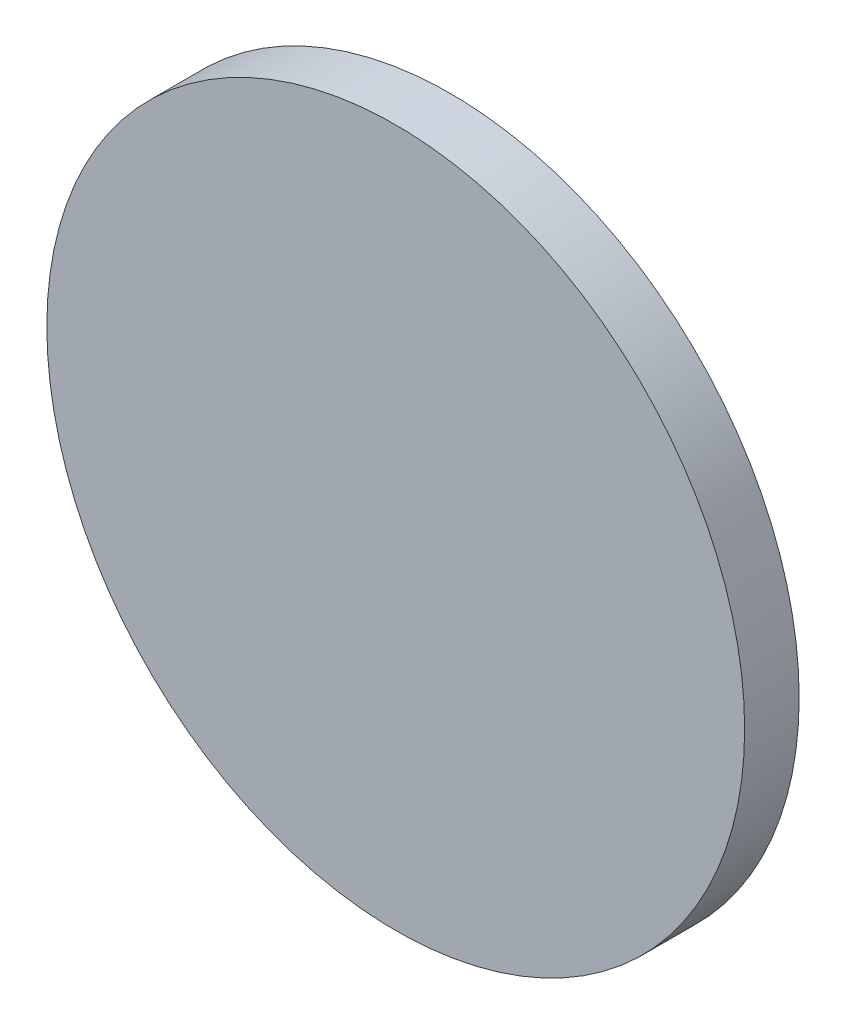
ISO-10303-21;
HEADER;
FILE_DESCRIPTION(('STEP AP214'),'2;1');
FILE_NAME('part.step','',(''),(''),'','','');
FILE_SCHEMA(('AUTOMOTIVE_DESIGN { 1 0 10303 214 1 1 1 1 }'));
ENDSEC;
DATA;
#1=APPLICATION_CONTEXT('core data for automotive mechanical design processes');
#2=APPLICATION_PROTOCOL_DEFINITION('international standard','automotive_design',2000,#1);
#3=PRODUCT_CONTEXT('',#1,'mechanical');
#4=PRODUCT('Part','Part','',(#3));
#5=PRODUCT_RELATED_PRODUCT_CATEGORY('part','',(#4));
#6=PRODUCT_DEFINITION_FORMATION('','',#4);
#7=PRODUCT_DEFINITION_CONTEXT('part definition',#1,'design');
#8=PRODUCT_DEFINITION('design','',#6,#7);
#9=PRODUCT_DEFINITION_SHAPE('','',#8);
#10=(LENGTH_UNIT() NAMED_UNIT(*) SI_UNIT(.MILLI.,.METRE.));
#11=(NAMED_UNIT(*) PLANE_ANGLE_UNIT() SI_UNIT($,.RADIAN.));
#12=(NAMED_UNIT(*) SI_UNIT($,.STERADIAN.) SOLID_ANGLE_UNIT());
#13=UNCERTAINTY_MEASURE_WITH_UNIT(LENGTH_MEASURE(1.E-05),#10,'distance_accuracy_value','');
#14=(GEOMETRIC_REPRESENTATION_CONTEXT(3) GLOBAL_UNCERTAINTY_ASSIGNED_CONTEXT((#13)) GLOBAL_UNIT_ASSIGNED_CONTEXT((#10,
#11,#12)) REPRESENTATION_CONTEXT('',''));
#15=CARTESIAN_POINT('',(0.,0.,0.));
#16=DIRECTION('',(0.,0.,1.));
#17=DIRECTION('',(1.,0.,0.));
#18=AXIS2_PLACEMENT_3D('',#15,#16,#17);
#19=CARTESIAN_POINT('',(0.,0.,10.));
#20=DIRECTION('',(0.,0.,-1.));
#21=DIRECTION('',(-1.,0.,0.));
#22=AXIS2_PLACEMENT_3D('',#19,#20,#21);
#23=CYLINDRICAL_SURFACE('',#22,64.);
#24=CARTESIAN_POINT('',(0.,0.,10.));
#25=DIRECTION('',(0.,0.,1.));
#26=DIRECTION('',(1.,0.,0.));
#27=AXIS2_PLACEMENT_3D('',#24,#25,#26);
#28=CIRCLE('',#27,64.);
#29=CARTESIAN_POINT('',(64.,0.,10.));
#30=VERTEX_POINT('',#29);
#31=EDGE_CURVE('E10',#30,#30,#28,.T.);
#32=ORIENTED_EDGE('',*,*,#31,.F.);
#33=EDGE_LOOP('',(#32));
#34=FACE_BOUND('',#33,.T.);
#35=CARTESIAN_POINT('',(0.,0.,0.));
#36=DIRECTION('',(0.,0.,1.));
#37=DIRECTION('',(1.,0.,0.));
#38=AXIS2_PLACEMENT_3D('',#35,#36,#37);
#39=CIRCLE('',#38,64.);
#40=CARTESIAN_POINT('',(64.,0.,0.));
#41=VERTEX_POINT('',#40);
#42=EDGE_CURVE('E40',#41,#41,#39,.T.);
#43=ORIENTED_EDGE('',*,*,#42,.T.);
#44=EDGE_LOOP('',(#43));
#45=FACE_BOUND('',#44,.T.);
#46=ADVANCED_FACE('F37',(#34,#45),#23,.T.);
#47=CARTESIAN_POINT('',(0.,0.,10.));
#48=DIRECTION('',(0.,0.,1.));
#49=DIRECTION('',(1.,0.,0.));
#50=AXIS2_PLACEMENT_3D('',#47,#48,#49);
#51=PLANE('',#50);
#52=ORIENTED_EDGE('',*,*,#31,.T.);
#53=EDGE_LOOP('',(#52));
#54=FACE_BOUND('',#53,.T.);
#55=ADVANCED_FACE('F54',(#54),#51,.T.);
#56=CARTESIAN_POINT('',(0.,0.,0.));
#57=DIRECTION('',(0.,0.,1.));
#58=DIRECTION('',(1.,0.,0.));
#59=AXIS2_PLACEMENT_3D('',#56,#57,#58);
#60=PLANE('',#59);
#61=ORIENTED_EDGE('',*,*,#42,.F.);
#62=EDGE_LOOP('',(#61));
#63=FACE_BOUND('',#62,.T.);
#64=ADVANCED_FACE('F52',(#63),#60,.F.);
#65=CLOSED_SHELL('',(#46,#55,#64));
#66=MANIFOLD_SOLID_BREP('B2',#65);
#67=ADVANCED_BREP_SHAPE_REPRESENTATION('',(#18,#66),#14);
#68=SHAPE_DEFINITION_REPRESENTATION(#9,#67);
ENDSEC;
END-ISO-10303-21;
